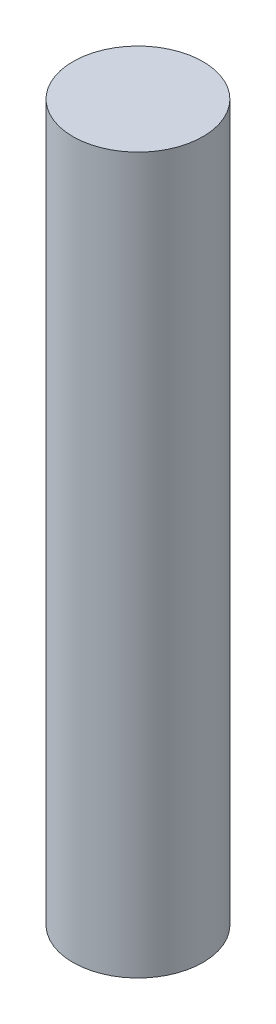
ISO-10303-21;
HEADER;
FILE_DESCRIPTION(('STEP AP214'),'2;1');
FILE_NAME('part.step','',(''),(''),'','','');
FILE_SCHEMA(('AUTOMOTIVE_DESIGN { 1 0 10303 214 1 1 1 1 }'));
ENDSEC;
DATA;
#1=APPLICATION_CONTEXT('core data for automotive mechanical design processes');
#2=APPLICATION_PROTOCOL_DEFINITION('international standard','automotive_design',2000,#1);
#3=PRODUCT_CONTEXT('',#1,'mechanical');
#4=PRODUCT('Part','Part','',(#3));
#5=PRODUCT_RELATED_PRODUCT_CATEGORY('part','',(#4));
#6=PRODUCT_DEFINITION_FORMATION('','',#4);
#7=PRODUCT_DEFINITION_CONTEXT('part definition',#1,'design');
#8=PRODUCT_DEFINITION('design','',#6,#7);
#9=PRODUCT_DEFINITION_SHAPE('','',#8);
#10=(LENGTH_UNIT() NAMED_UNIT(*) SI_UNIT(.MILLI.,.METRE.));
#11=(NAMED_UNIT(*) PLANE_ANGLE_UNIT() SI_UNIT($,.RADIAN.));
#12=(NAMED_UNIT(*) SI_UNIT($,.STERADIAN.) SOLID_ANGLE_UNIT());
#13=UNCERTAINTY_MEASURE_WITH_UNIT(LENGTH_MEASURE(1.E-05),#10,'distance_accuracy_value','');
#14=(GEOMETRIC_REPRESENTATION_CONTEXT(3) GLOBAL_UNCERTAINTY_ASSIGNED_CONTEXT((#13)) GLOBAL_UNIT_ASSIGNED_CONTEXT((#10,
#11,#12)) REPRESENTATION_CONTEXT('',''));
#15=CARTESIAN_POINT('',(0.,0.,0.));
#16=DIRECTION('',(0.,0.,1.));
#17=DIRECTION('',(1.,0.,0.));
#18=AXIS2_PLACEMENT_3D('',#15,#16,#17);
#19=CARTESIAN_POINT('',(0.,55.,0.));
#20=DIRECTION('',(0.,-1.,0.));
#21=DIRECTION('',(0.,0.,-1.));
#22=AXIS2_PLACEMENT_3D('',#19,#20,#21);
#23=CYLINDRICAL_SURFACE('',#22,5.);
#24=CARTESIAN_POINT('',(0.,55.,0.));
#25=DIRECTION('',(0.,1.,0.));
#26=DIRECTION('',(0.,0.,1.));
#27=AXIS2_PLACEMENT_3D('',#24,#25,#26);
#28=CIRCLE('',#27,5.);
#29=CARTESIAN_POINT('',(0.,55.,5.));
#30=VERTEX_POINT('',#29);
#31=EDGE_CURVE('E10',#30,#30,#28,.T.);
#32=ORIENTED_EDGE('',*,*,#31,.F.);
#33=EDGE_LOOP('',(#32));
#34=FACE_BOUND('',#33,.T.);
#35=CARTESIAN_POINT('',(0.,0.,0.));
#36=DIRECTION('',(0.,1.,0.));
#37=DIRECTION('',(0.,0.,1.));
#38=AXIS2_PLACEMENT_3D('',#35,#36,#37);
#39=CIRCLE('',#38,5.);
#40=CARTESIAN_POINT('',(0.,0.,5.));
#41=VERTEX_POINT('',#40);
#42=EDGE_CURVE('E40',#41,#41,#39,.T.);
#43=ORIENTED_EDGE('',*,*,#42,.T.);
#44=EDGE_LOOP('',(#43));
#45=FACE_BOUND('',#44,.T.);
#46=ADVANCED_FACE('F37',(#34,#45),#23,.T.);
#47=CARTESIAN_POINT('',(0.,55.,0.));
#48=DIRECTION('',(0.,1.,0.));
#49=DIRECTION('',(0.,0.,1.));
#50=AXIS2_PLACEMENT_3D('',#47,#48,#49);
#51=PLANE('',#50);
#52=ORIENTED_EDGE('',*,*,#31,.T.);
#53=EDGE_LOOP('',(#52));
#54=FACE_BOUND('',#53,.T.);
#55=ADVANCED_FACE('F54',(#54),#51,.T.);
#56=CARTESIAN_POINT('',(0.,0.,0.));
#57=DIRECTION('',(0.,1.,0.));
#58=DIRECTION('',(0.,0.,1.));
#59=AXIS2_PLACEMENT_3D('',#56,#57,#58);
#60=PLANE('',#59);
#61=ORIENTED_EDGE('',*,*,#42,.F.);
#62=EDGE_LOOP('',(#61));
#63=FACE_BOUND('',#62,.T.);
#64=ADVANCED_FACE('F52',(#63),#60,.F.);
#65=CLOSED_SHELL('',(#46,#55,#64));
#66=MANIFOLD_SOLID_BREP('B2',#65);
#67=ADVANCED_BREP_SHAPE_REPRESENTATION('',(#18,#66),#14);
#68=SHAPE_DEFINITION_REPRESENTATION(#9,#67);
ENDSEC;
END-ISO-10303-21;
